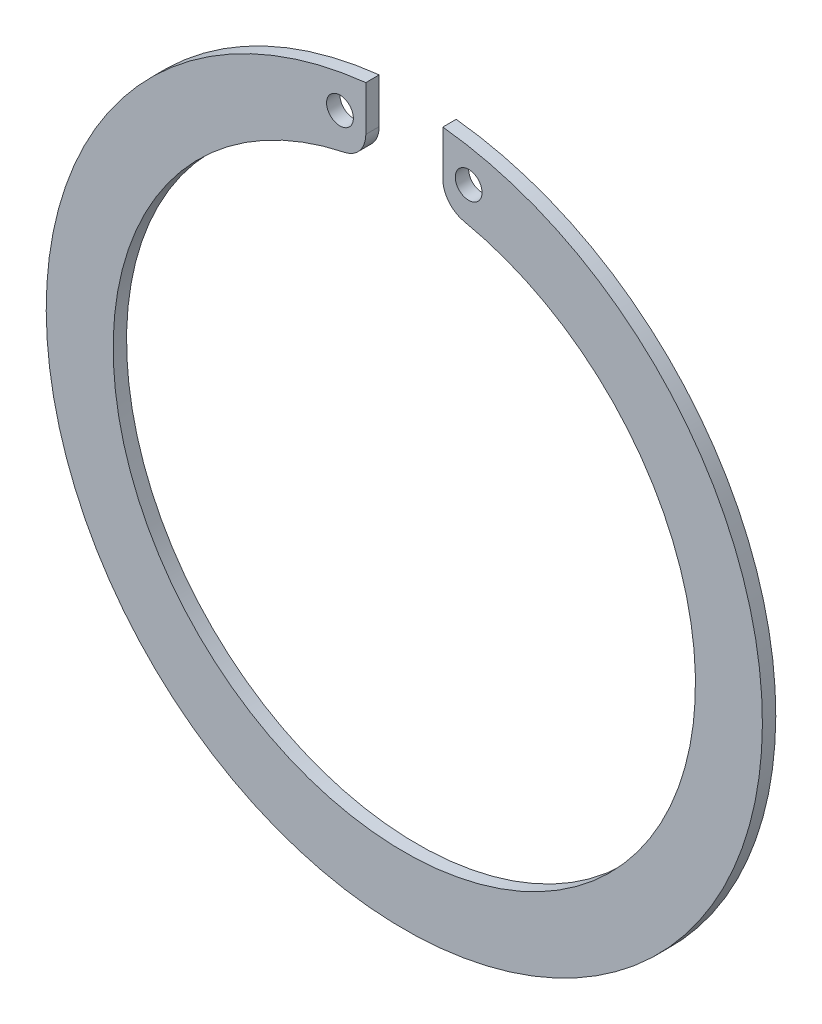
ISO-10303-21;
HEADER;
FILE_DESCRIPTION(('STEP AP214'),'2;1');
FILE_NAME('part.step','',(''),(''),'','','');
FILE_SCHEMA(('AUTOMOTIVE_DESIGN { 1 0 10303 214 1 1 1 1 }'));
ENDSEC;
DATA;
#1=APPLICATION_CONTEXT('core data for automotive mechanical design processes');
#2=APPLICATION_PROTOCOL_DEFINITION('international standard','automotive_design',2000,#1);
#3=PRODUCT_CONTEXT('',#1,'mechanical');
#4=PRODUCT('Part','Part','',(#3));
#5=PRODUCT_RELATED_PRODUCT_CATEGORY('part','',(#4));
#6=PRODUCT_DEFINITION_FORMATION('','',#4);
#7=PRODUCT_DEFINITION_CONTEXT('part definition',#1,'design');
#8=PRODUCT_DEFINITION('design','',#6,#7);
#9=PRODUCT_DEFINITION_SHAPE('','',#8);
#10=(LENGTH_UNIT() NAMED_UNIT(*) SI_UNIT(.MILLI.,.METRE.));
#11=(NAMED_UNIT(*) PLANE_ANGLE_UNIT() SI_UNIT($,.RADIAN.));
#12=(NAMED_UNIT(*) SI_UNIT($,.STERADIAN.) SOLID_ANGLE_UNIT());
#13=UNCERTAINTY_MEASURE_WITH_UNIT(LENGTH_MEASURE(1.E-05),#10,'distance_accuracy_value','');
#14=(GEOMETRIC_REPRESENTATION_CONTEXT(3) GLOBAL_UNCERTAINTY_ASSIGNED_CONTEXT((#13)) GLOBAL_UNIT_ASSIGNED_CONTEXT((#10,
#11,#12)) REPRESENTATION_CONTEXT('',''));
#15=CARTESIAN_POINT('',(0.,0.,0.));
#16=DIRECTION('',(0.,0.,1.));
#17=DIRECTION('',(1.,0.,0.));
#18=AXIS2_PLACEMENT_3D('',#15,#16,#17);
#19=CARTESIAN_POINT('',(0.,0.,1.));
#20=DIRECTION('',(0.,0.,1.));
#21=DIRECTION('',(1.,0.,0.));
#22=AXIS2_PLACEMENT_3D('',#19,#20,#21);
#23=PLANE('',#22);
#24=CARTESIAN_POINT('',(-4.80705090489932,23.8232792893801,1.));
#25=DIRECTION('',(0.,0.,1.));
#26=DIRECTION('',(1.,0.,0.));
#27=AXIS2_PLACEMENT_3D('',#24,#25,#26);
#28=CIRCLE('',#27,1.);
#29=CARTESIAN_POINT('',(-3.80705090489931,23.8232792893801,1.));
#30=VERTEX_POINT('',#29);
#31=EDGE_CURVE('E146',#30,#30,#28,.T.);
#32=ORIENTED_EDGE('',*,*,#31,.F.);
#33=EDGE_LOOP('',(#32));
#34=FACE_BOUND('',#33,.T.);
#35=CARTESIAN_POINT('',(4.80705090489932,23.8232792893801,1.));
#36=DIRECTION('',(0.,0.,1.));
#37=DIRECTION('',(-1.,0.,0.));
#38=AXIS2_PLACEMENT_3D('',#35,#36,#37);
#39=CIRCLE('',#38,1.);
#40=CARTESIAN_POINT('',(3.80705090489932,23.8232792893801,1.));
#41=VERTEX_POINT('',#40);
#42=EDGE_CURVE('E151',#41,#41,#39,.T.);
#43=ORIENTED_EDGE('',*,*,#42,.F.);
#44=EDGE_LOOP('',(#43));
#45=FACE_BOUND('',#44,.T.);
#46=DIRECTION('',(0.,1.,0.));
#47=VECTOR('',#46,1.);
#48=CARTESIAN_POINT('',(2.87561938355589,7.62039136642311,1.));
#49=LINE('',#48,#47);
#50=CARTESIAN_POINT('',(2.87561938355589,23.2441570212106,1.));
#51=VERTEX_POINT('',#50);
#52=CARTESIAN_POINT('',(2.87561938355589,26.5949866170472,1.));
#53=VERTEX_POINT('',#52);
#54=EDGE_CURVE('E121',#51,#53,#49,.T.);
#55=ORIENTED_EDGE('',*,*,#54,.F.);
#56=CARTESIAN_POINT('',(4.87561938355589,23.2441570212106,1.));
#57=DIRECTION('',(0.,0.,1.));
#58=DIRECTION('',(1.,0.,0.));
#59=AXIS2_PLACEMENT_3D('',#56,#57,#58);
#60=CIRCLE('',#59,2.);
#61=CARTESIAN_POINT('',(4.46504090915118,21.2867543246876,1.));
#62=VERTEX_POINT('',#61);
#63=EDGE_CURVE('E138',#51,#62,#60,.T.);
#64=ORIENTED_EDGE('',*,*,#63,.T.);
#65=CARTESIAN_POINT('',(0.,0.,1.));
#66=DIRECTION('',(0.,0.,1.));
#67=DIRECTION('',(1.,0.,0.));
#68=AXIS2_PLACEMENT_3D('',#65,#66,#67);
#69=CIRCLE('',#68,21.75);
#70=CARTESIAN_POINT('',(-4.46504090915118,21.2867543246876,1.));
#71=VERTEX_POINT('',#70);
#72=EDGE_CURVE('E132',#71,#62,#69,.T.);
#73=ORIENTED_EDGE('',*,*,#72,.F.);
#74=CARTESIAN_POINT('',(-4.87561938355589,23.2441570212106,1.));
#75=DIRECTION('',(0.,0.,1.));
#76=DIRECTION('',(1.,0.,0.));
#77=AXIS2_PLACEMENT_3D('',#74,#75,#76);
#78=CIRCLE('',#77,2.);
#79=CARTESIAN_POINT('',(-2.87561938355589,23.2441570212106,1.));
#80=VERTEX_POINT('',#79);
#81=EDGE_CURVE('E120',#71,#80,#78,.T.);
#82=ORIENTED_EDGE('',*,*,#81,.T.);
#83=DIRECTION('',(0.,-1.,0.));
#84=VECTOR('',#83,1.);
#85=CARTESIAN_POINT('',(-2.87561938355589,7.62039136642311,1.));
#86=LINE('',#85,#84);
#87=CARTESIAN_POINT('',(-2.87561938355589,26.5949866170472,1.));
#88=VERTEX_POINT('',#87);
#89=EDGE_CURVE('E105',#88,#80,#86,.T.);
#90=ORIENTED_EDGE('',*,*,#89,.F.);
#91=CARTESIAN_POINT('',(0.,0.,1.));
#92=DIRECTION('',(0.,0.,1.));
#93=DIRECTION('',(1.,0.,0.));
#94=AXIS2_PLACEMENT_3D('',#91,#92,#93);
#95=CIRCLE('',#94,26.75);
#96=EDGE_CURVE('E117',#88,#53,#95,.T.);
#97=ORIENTED_EDGE('',*,*,#96,.T.);
#98=EDGE_LOOP('',(#55,#64,#73,#82,#90,#97));
#99=FACE_BOUND('',#98,.T.);
#100=ADVANCED_FACE('F45',(#34,#45,#99),#23,.T.);
#101=CARTESIAN_POINT('',(0.,0.,0.));
#102=DIRECTION('',(0.,0.,1.));
#103=DIRECTION('',(1.,0.,0.));
#104=AXIS2_PLACEMENT_3D('',#101,#102,#103);
#105=PLANE('',#104);
#106=CARTESIAN_POINT('',(-4.80705090489932,23.8232792893801,0.));
#107=DIRECTION('',(0.,0.,1.));
#108=DIRECTION('',(1.,0.,0.));
#109=AXIS2_PLACEMENT_3D('',#106,#107,#108);
#110=CIRCLE('',#109,1.);
#111=CARTESIAN_POINT('',(-3.80705090489931,23.8232792893801,0.));
#112=VERTEX_POINT('',#111);
#113=EDGE_CURVE('E49',#112,#112,#110,.T.);
#114=ORIENTED_EDGE('',*,*,#113,.T.);
#115=EDGE_LOOP('',(#114));
#116=FACE_BOUND('',#115,.T.);
#117=CARTESIAN_POINT('',(4.80705090489932,23.8232792893801,0.));
#118=DIRECTION('',(0.,0.,1.));
#119=DIRECTION('',(1.,0.,0.));
#120=AXIS2_PLACEMENT_3D('',#117,#118,#119);
#121=CIRCLE('',#120,1.);
#122=CARTESIAN_POINT('',(5.80705090489932,23.8232792893801,0.));
#123=VERTEX_POINT('',#122);
#124=EDGE_CURVE('E144',#123,#123,#121,.T.);
#125=ORIENTED_EDGE('',*,*,#124,.T.);
#126=EDGE_LOOP('',(#125));
#127=FACE_BOUND('',#126,.T.);
#128=CARTESIAN_POINT('',(0.,0.,0.));
#129=DIRECTION('',(0.,0.,1.));
#130=DIRECTION('',(1.,0.,0.));
#131=AXIS2_PLACEMENT_3D('',#128,#129,#130);
#132=CIRCLE('',#131,21.75);
#133=CARTESIAN_POINT('',(-4.46504090915118,21.2867543246876,0.));
#134=VERTEX_POINT('',#133);
#135=CARTESIAN_POINT('',(4.46504090915118,21.2867543246876,0.));
#136=VERTEX_POINT('',#135);
#137=EDGE_CURVE('E112',#134,#136,#132,.T.);
#138=ORIENTED_EDGE('',*,*,#137,.T.);
#139=CARTESIAN_POINT('',(4.87561938355589,23.2441570212106,0.));
#140=DIRECTION('',(0.,0.,1.));
#141=DIRECTION('',(1.,0.,0.));
#142=AXIS2_PLACEMENT_3D('',#139,#140,#141);
#143=CIRCLE('',#142,2.);
#144=CARTESIAN_POINT('',(2.87561938355589,23.2441570212106,0.));
#145=VERTEX_POINT('',#144);
#146=EDGE_CURVE('E54',#136,#145,#143,.F.);
#147=ORIENTED_EDGE('',*,*,#146,.T.);
#148=DIRECTION('',(0.,1.,0.));
#149=VECTOR('',#148,1.);
#150=CARTESIAN_POINT('',(2.87561938355589,0.,0.));
#151=LINE('',#150,#149);
#152=CARTESIAN_POINT('',(2.87561938355589,26.5949866170472,0.));
#153=VERTEX_POINT('',#152);
#154=EDGE_CURVE('E159',#145,#153,#151,.T.);
#155=ORIENTED_EDGE('',*,*,#154,.T.);
#156=CARTESIAN_POINT('',(0.,0.,0.));
#157=DIRECTION('',(0.,0.,1.));
#158=DIRECTION('',(1.,0.,0.));
#159=AXIS2_PLACEMENT_3D('',#156,#157,#158);
#160=CIRCLE('',#159,26.75);
#161=CARTESIAN_POINT('',(-2.87561938355589,26.5949866170472,0.));
#162=VERTEX_POINT('',#161);
#163=EDGE_CURVE('E128',#162,#153,#160,.T.);
#164=ORIENTED_EDGE('',*,*,#163,.F.);
#165=DIRECTION('',(0.,-1.,0.));
#166=VECTOR('',#165,1.);
#167=CARTESIAN_POINT('',(-2.87561938355589,0.,0.));
#168=LINE('',#167,#166);
#169=CARTESIAN_POINT('',(-2.87561938355589,23.2441570212106,0.));
#170=VERTEX_POINT('',#169);
#171=EDGE_CURVE('E107',#162,#170,#168,.T.);
#172=ORIENTED_EDGE('',*,*,#171,.T.);
#173=CARTESIAN_POINT('',(-4.87561938355589,23.2441570212106,0.));
#174=DIRECTION('',(0.,0.,1.));
#175=DIRECTION('',(1.,0.,0.));
#176=AXIS2_PLACEMENT_3D('',#173,#174,#175);
#177=CIRCLE('',#176,2.);
#178=EDGE_CURVE('E62',#170,#134,#177,.F.);
#179=ORIENTED_EDGE('',*,*,#178,.T.);
#180=EDGE_LOOP('',(#138,#147,#155,#164,#172,#179));
#181=FACE_BOUND('',#180,.T.);
#182=ADVANCED_FACE('F164',(#116,#127,#181),#105,.F.);
#183=CARTESIAN_POINT('',(0.,0.,1.));
#184=DIRECTION('',(0.,0.,-1.));
#185=DIRECTION('',(-1.,0.,0.));
#186=AXIS2_PLACEMENT_3D('',#183,#184,#185);
#187=CYLINDRICAL_SURFACE('',#186,26.75);
#188=ORIENTED_EDGE('',*,*,#96,.F.);
#189=DIRECTION('',(0.,0.,-1.));
#190=VECTOR('',#189,1.);
#191=CARTESIAN_POINT('',(-2.87561938355589,26.5949866170472,1.));
#192=LINE('',#191,#190);
#193=EDGE_CURVE('E102',#88,#162,#192,.T.);
#194=ORIENTED_EDGE('',*,*,#193,.T.);
#195=ORIENTED_EDGE('',*,*,#163,.T.);
#196=DIRECTION('',(0.,0.,-1.));
#197=VECTOR('',#196,1.);
#198=CARTESIAN_POINT('',(2.87561938355589,26.5949866170472,1.));
#199=LINE('',#198,#197);
#200=EDGE_CURVE('E126',#153,#53,#199,.F.);
#201=ORIENTED_EDGE('',*,*,#200,.T.);
#202=EDGE_LOOP('',(#188,#194,#195,#201));
#203=FACE_BOUND('',#202,.T.);
#204=ADVANCED_FACE('F124',(#203),#187,.T.);
#205=CARTESIAN_POINT('',(0.,0.,1.));
#206=DIRECTION('',(0.,0.,-1.));
#207=DIRECTION('',(-1.,0.,0.));
#208=AXIS2_PLACEMENT_3D('',#205,#206,#207);
#209=CYLINDRICAL_SURFACE('',#208,21.75);
#210=ORIENTED_EDGE('',*,*,#72,.T.);
#211=DIRECTION('',(0.,0.,-1.));
#212=VECTOR('',#211,1.);
#213=CARTESIAN_POINT('',(4.46504090915119,21.2867543246876,1.));
#214=LINE('',#213,#212);
#215=EDGE_CURVE('E69',#62,#136,#214,.T.);
#216=ORIENTED_EDGE('',*,*,#215,.T.);
#217=ORIENTED_EDGE('',*,*,#137,.F.);
#218=DIRECTION('',(0.,0.,-1.));
#219=VECTOR('',#218,1.);
#220=CARTESIAN_POINT('',(-4.46504090915119,21.2867543246876,1.));
#221=LINE('',#220,#219);
#222=EDGE_CURVE('E140',#134,#71,#221,.F.);
#223=ORIENTED_EDGE('',*,*,#222,.T.);
#224=EDGE_LOOP('',(#210,#216,#217,#223));
#225=FACE_BOUND('',#224,.T.);
#226=ADVANCED_FACE('F171',(#225),#209,.F.);
#227=CARTESIAN_POINT('',(2.87561938355589,7.62039136642311,-9.));
#228=DIRECTION('',(1.,0.,0.));
#229=DIRECTION('',(0.,0.,-1.));
#230=AXIS2_PLACEMENT_3D('',#227,#228,#229);
#231=PLANE('',#230);
#232=ORIENTED_EDGE('',*,*,#154,.F.);
#233=DIRECTION('',(0.,0.,1.));
#234=VECTOR('',#233,1.);
#235=CARTESIAN_POINT('',(2.87561938355589,23.2441570212106,1.));
#236=LINE('',#235,#234);
#237=EDGE_CURVE('E127',#145,#51,#236,.T.);
#238=ORIENTED_EDGE('',*,*,#237,.T.);
#239=ORIENTED_EDGE('',*,*,#54,.T.);
#240=ORIENTED_EDGE('',*,*,#200,.F.);
#241=EDGE_LOOP('',(#232,#238,#239,#240));
#242=FACE_BOUND('',#241,.T.);
#243=ADVANCED_FACE('F170',(#242),#231,.F.);
#244=CARTESIAN_POINT('',(-2.87561938355589,7.62039136642311,-9.));
#245=DIRECTION('',(-1.,0.,0.));
#246=DIRECTION('',(0.,0.,1.));
#247=AXIS2_PLACEMENT_3D('',#244,#245,#246);
#248=PLANE('',#247);
#249=ORIENTED_EDGE('',*,*,#89,.T.);
#250=DIRECTION('',(0.,0.,1.));
#251=VECTOR('',#250,1.);
#252=CARTESIAN_POINT('',(-2.87561938355589,23.2441570212106,0.));
#253=LINE('',#252,#251);
#254=EDGE_CURVE('E12',#80,#170,#253,.F.);
#255=ORIENTED_EDGE('',*,*,#254,.T.);
#256=ORIENTED_EDGE('',*,*,#171,.F.);
#257=ORIENTED_EDGE('',*,*,#193,.F.);
#258=EDGE_LOOP('',(#249,#255,#256,#257));
#259=FACE_BOUND('',#258,.T.);
#260=ADVANCED_FACE('F104',(#259),#248,.F.);
#261=CARTESIAN_POINT('',(4.87561938355589,23.2441570212106,1.));
#262=DIRECTION('',(0.,0.,-1.));
#263=DIRECTION('',(-1.,0.,0.));
#264=AXIS2_PLACEMENT_3D('',#261,#262,#263);
#265=CYLINDRICAL_SURFACE('',#264,2.);
#266=ORIENTED_EDGE('',*,*,#146,.F.);
#267=ORIENTED_EDGE('',*,*,#215,.F.);
#268=ORIENTED_EDGE('',*,*,#63,.F.);
#269=ORIENTED_EDGE('',*,*,#237,.F.);
#270=EDGE_LOOP('',(#266,#267,#268,#269));
#271=FACE_BOUND('',#270,.T.);
#272=ADVANCED_FACE('F168',(#271),#265,.T.);
#273=CARTESIAN_POINT('',(-4.87561938355589,23.2441570212106,1.));
#274=DIRECTION('',(0.,0.,-1.));
#275=DIRECTION('',(-1.,0.,0.));
#276=AXIS2_PLACEMENT_3D('',#273,#274,#275);
#277=CYLINDRICAL_SURFACE('',#276,2.);
#278=ORIENTED_EDGE('',*,*,#81,.F.);
#279=ORIENTED_EDGE('',*,*,#222,.F.);
#280=ORIENTED_EDGE('',*,*,#178,.F.);
#281=ORIENTED_EDGE('',*,*,#254,.F.);
#282=EDGE_LOOP('',(#278,#279,#280,#281));
#283=FACE_BOUND('',#282,.T.);
#284=ADVANCED_FACE('F47',(#283),#277,.T.);
#285=CARTESIAN_POINT('',(4.80705090489932,23.8232792893801,-9.));
#286=DIRECTION('',(0.,0.,1.));
#287=DIRECTION('',(1.,0.,0.));
#288=AXIS2_PLACEMENT_3D('',#285,#286,#287);
#289=CYLINDRICAL_SURFACE('',#288,1.);
#290=ORIENTED_EDGE('',*,*,#42,.T.);
#291=EDGE_LOOP('',(#290));
#292=FACE_BOUND('',#291,.T.);
#293=ORIENTED_EDGE('',*,*,#124,.F.);
#294=EDGE_LOOP('',(#293));
#295=FACE_BOUND('',#294,.T.);
#296=ADVANCED_FACE('F195',(#292,#295),#289,.F.);
#297=CARTESIAN_POINT('',(-4.80705090489932,23.8232792893801,-9.));
#298=DIRECTION('',(0.,0.,1.));
#299=DIRECTION('',(1.,0.,0.));
#300=AXIS2_PLACEMENT_3D('',#297,#298,#299);
#301=CYLINDRICAL_SURFACE('',#300,1.);
#302=ORIENTED_EDGE('',*,*,#31,.T.);
#303=EDGE_LOOP('',(#302));
#304=FACE_BOUND('',#303,.T.);
#305=ORIENTED_EDGE('',*,*,#113,.F.);
#306=EDGE_LOOP('',(#305));
#307=FACE_BOUND('',#306,.T.);
#308=ADVANCED_FACE('F201',(#304,#307),#301,.F.);
#309=CLOSED_SHELL('',(#100,#182,#204,#226,#243,#260,#272,#284,#296,#308));
#310=MANIFOLD_SOLID_BREP('B2',#309);
#311=ADVANCED_BREP_SHAPE_REPRESENTATION('',(#18,#310),#14);
#312=SHAPE_DEFINITION_REPRESENTATION(#9,#311);
ENDSEC;
END-ISO-10303-21;
